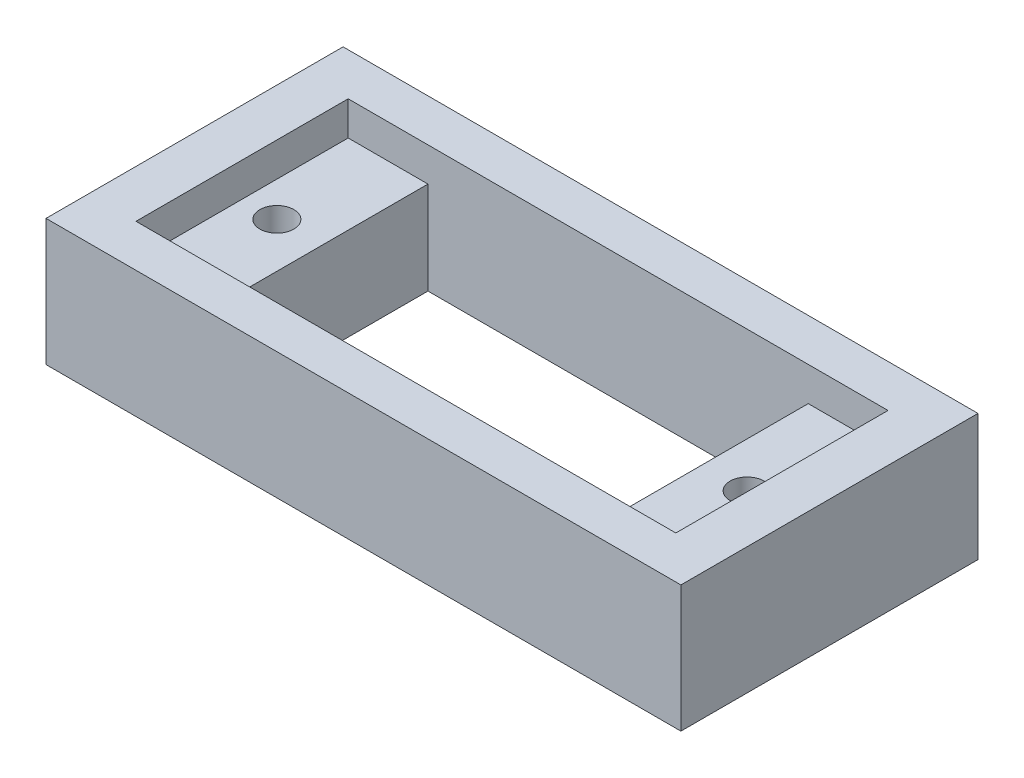
ISO-10303-21;
HEADER;
FILE_DESCRIPTION(('STEP AP214'),'2;1');
FILE_NAME('part.step','',(''),(''),'','','');
FILE_SCHEMA(('AUTOMOTIVE_DESIGN { 1 0 10303 214 1 1 1 1 }'));
ENDSEC;
DATA;
#1=APPLICATION_CONTEXT('core data for automotive mechanical design processes');
#2=APPLICATION_PROTOCOL_DEFINITION('international standard','automotive_design',2000,#1);
#3=PRODUCT_CONTEXT('',#1,'mechanical');
#4=PRODUCT('Part','Part','',(#3));
#5=PRODUCT_RELATED_PRODUCT_CATEGORY('part','',(#4));
#6=PRODUCT_DEFINITION_FORMATION('','',#4);
#7=PRODUCT_DEFINITION_CONTEXT('part definition',#1,'design');
#8=PRODUCT_DEFINITION('design','',#6,#7);
#9=PRODUCT_DEFINITION_SHAPE('','',#8);
#10=(LENGTH_UNIT() NAMED_UNIT(*) SI_UNIT(.MILLI.,.METRE.));
#11=(NAMED_UNIT(*) PLANE_ANGLE_UNIT() SI_UNIT($,.RADIAN.));
#12=(NAMED_UNIT(*) SI_UNIT($,.STERADIAN.) SOLID_ANGLE_UNIT());
#13=UNCERTAINTY_MEASURE_WITH_UNIT(LENGTH_MEASURE(1.E-05),#10,'distance_accuracy_value','');
#14=(GEOMETRIC_REPRESENTATION_CONTEXT(3) GLOBAL_UNCERTAINTY_ASSIGNED_CONTEXT((#13)) GLOBAL_UNIT_ASSIGNED_CONTEXT((#10,
#11,#12)) REPRESENTATION_CONTEXT('',''));
#15=CARTESIAN_POINT('',(0.,0.,0.));
#16=DIRECTION('',(0.,0.,1.));
#17=DIRECTION('',(1.,0.,0.));
#18=AXIS2_PLACEMENT_3D('',#15,#16,#17);
#19=CARTESIAN_POINT('',(11.2,-7.46,-6.25));
#20=DIRECTION('',(1.,0.,0.));
#21=DIRECTION('',(0.,0.,-1.));
#22=AXIS2_PLACEMENT_3D('',#19,#20,#21);
#23=PLANE('',#22);
#24=DIRECTION('',(0.,0.,1.));
#25=VECTOR('',#24,1.);
#26=CARTESIAN_POINT('',(11.2,-2.,-6.25));
#27=LINE('',#26,#25);
#28=CARTESIAN_POINT('',(11.2,-2.,-6.25));
#29=VERTEX_POINT('',#28);
#30=CARTESIAN_POINT('',(11.2,-2.,6.25));
#31=VERTEX_POINT('',#30);
#32=EDGE_CURVE('E165',#29,#31,#27,.T.);
#33=ORIENTED_EDGE('',*,*,#32,.F.);
#34=DIRECTION('',(0.,1.,0.));
#35=VECTOR('',#34,1.);
#36=CARTESIAN_POINT('',(11.2,-7.46,-6.25));
#37=LINE('',#36,#35);
#38=CARTESIAN_POINT('',(11.2,-7.46,-6.25));
#39=VERTEX_POINT('',#38);
#40=EDGE_CURVE('E137',#39,#29,#37,.T.);
#41=ORIENTED_EDGE('',*,*,#40,.F.);
#42=DIRECTION('',(0.,0.,-1.));
#43=VECTOR('',#42,1.);
#44=CARTESIAN_POINT('',(11.2,-7.46,-6.25));
#45=LINE('',#44,#43);
#46=CARTESIAN_POINT('',(11.2,-7.46,6.25));
#47=VERTEX_POINT('',#46);
#48=EDGE_CURVE('E174',#47,#39,#45,.T.);
#49=ORIENTED_EDGE('',*,*,#48,.F.);
#50=DIRECTION('',(0.,1.,0.));
#51=VECTOR('',#50,1.);
#52=CARTESIAN_POINT('',(11.2,-7.46,6.25));
#53=LINE('',#52,#51);
#54=EDGE_CURVE('E189',#47,#31,#53,.T.);
#55=ORIENTED_EDGE('',*,*,#54,.T.);
#56=EDGE_LOOP('',(#33,#41,#49,#55));
#57=FACE_BOUND('',#56,.T.);
#58=ADVANCED_FACE('F32',(#57),#23,.F.);
#59=CARTESIAN_POINT('',(-11.2,-7.46,-6.25));
#60=DIRECTION('',(-1.,0.,0.));
#61=DIRECTION('',(0.,0.,1.));
#62=AXIS2_PLACEMENT_3D('',#59,#60,#61);
#63=PLANE('',#62);
#64=DIRECTION('',(0.,0.,-1.));
#65=VECTOR('',#64,1.);
#66=CARTESIAN_POINT('',(-11.2,-2.,-6.25));
#67=LINE('',#66,#65);
#68=CARTESIAN_POINT('',(-11.2,-2.,6.25));
#69=VERTEX_POINT('',#68);
#70=CARTESIAN_POINT('',(-11.2,-2.,-6.25));
#71=VERTEX_POINT('',#70);
#72=EDGE_CURVE('E163',#69,#71,#67,.T.);
#73=ORIENTED_EDGE('',*,*,#72,.F.);
#74=DIRECTION('',(0.,1.,0.));
#75=VECTOR('',#74,1.);
#76=CARTESIAN_POINT('',(-11.2,-7.46,6.25));
#77=LINE('',#76,#75);
#78=CARTESIAN_POINT('',(-11.2,-7.46,6.25));
#79=VERTEX_POINT('',#78);
#80=EDGE_CURVE('E193',#79,#69,#77,.T.);
#81=ORIENTED_EDGE('',*,*,#80,.F.);
#82=DIRECTION('',(0.,0.,1.));
#83=VECTOR('',#82,1.);
#84=CARTESIAN_POINT('',(-11.2,-7.46,-6.25));
#85=LINE('',#84,#83);
#86=CARTESIAN_POINT('',(-11.2,-7.46,-6.25));
#87=VERTEX_POINT('',#86);
#88=EDGE_CURVE('E181',#87,#79,#85,.T.);
#89=ORIENTED_EDGE('',*,*,#88,.F.);
#90=DIRECTION('',(0.,1.,0.));
#91=VECTOR('',#90,1.);
#92=CARTESIAN_POINT('',(-11.2,-7.46,-6.25));
#93=LINE('',#92,#91);
#94=EDGE_CURVE('E196',#87,#71,#93,.T.);
#95=ORIENTED_EDGE('',*,*,#94,.T.);
#96=EDGE_LOOP('',(#73,#81,#89,#95));
#97=FACE_BOUND('',#96,.T.);
#98=ADVANCED_FACE('F253',(#97),#63,.F.);
#99=CARTESIAN_POINT('',(13.85,-7.46,0.));
#100=DIRECTION('',(0.,1.,0.));
#101=DIRECTION('',(0.,0.,1.));
#102=AXIS2_PLACEMENT_3D('',#99,#100,#101);
#103=CYLINDRICAL_SURFACE('',#102,1.);
#104=CARTESIAN_POINT('',(13.85,-7.46,0.));
#105=DIRECTION('',(0.,1.,0.));
#106=DIRECTION('',(0.,0.,1.));
#107=AXIS2_PLACEMENT_3D('',#104,#105,#106);
#108=CIRCLE('',#107,1.);
#109=CARTESIAN_POINT('',(13.85,-7.46,1.));
#110=VERTEX_POINT('',#109);
#111=EDGE_CURVE('E170',#110,#110,#108,.T.);
#112=CARTESIAN_POINT('',(13.85,-2.,0.));
#113=DIRECTION('',(0.,1.,0.));
#114=DIRECTION('',(0.,0.,1.));
#115=AXIS2_PLACEMENT_3D('',#112,#113,#114);
#116=CIRCLE('',#115,1.);
#117=CARTESIAN_POINT('',(13.85,-2.,1.));
#118=VERTEX_POINT('',#117);
#119=EDGE_CURVE('E160',#118,#118,#116,.F.);
#120=CARTESIAN_POINT('',(13.85,-7.46,1.));
#121=CARTESIAN_POINT('',(13.85,-7.403125,1.));
#122=CARTESIAN_POINT('',(13.85,-7.34625,1.));
#123=CARTESIAN_POINT('',(13.85,-7.2325,1.));
#124=CARTESIAN_POINT('',(13.85,-7.175625,1.));
#125=CARTESIAN_POINT('',(13.85,-7.061875,1.));
#126=CARTESIAN_POINT('',(13.85,-7.005,1.));
#127=CARTESIAN_POINT('',(13.85,-6.89125,1.));
#128=CARTESIAN_POINT('',(13.85,-6.834375,1.));
#129=CARTESIAN_POINT('',(13.85,-6.720625,1.));
#130=CARTESIAN_POINT('',(13.85,-6.66375,1.));
#131=CARTESIAN_POINT('',(13.85,-6.55,1.));
#132=CARTESIAN_POINT('',(13.85,-6.493125,1.));
#133=CARTESIAN_POINT('',(13.85,-6.379375,1.));
#134=CARTESIAN_POINT('',(13.85,-6.3225,1.));
#135=CARTESIAN_POINT('',(13.85,-6.20875,1.));
#136=CARTESIAN_POINT('',(13.85,-6.151875,1.));
#137=CARTESIAN_POINT('',(13.85,-6.038125,1.));
#138=CARTESIAN_POINT('',(13.85,-5.98125,1.));
#139=CARTESIAN_POINT('',(13.85,-5.8675,1.));
#140=CARTESIAN_POINT('',(13.85,-5.810625,1.));
#141=CARTESIAN_POINT('',(13.85,-5.696875,1.));
#142=CARTESIAN_POINT('',(13.85,-5.64,1.));
#143=CARTESIAN_POINT('',(13.85,-5.52625,1.));
#144=CARTESIAN_POINT('',(13.85,-5.469375,1.));
#145=CARTESIAN_POINT('',(13.85,-5.355625,1.));
#146=CARTESIAN_POINT('',(13.85,-5.29875,1.));
#147=CARTESIAN_POINT('',(13.85,-5.185,1.));
#148=CARTESIAN_POINT('',(13.85,-5.128125,1.));
#149=CARTESIAN_POINT('',(13.85,-5.014375,1.));
#150=CARTESIAN_POINT('',(13.85,-4.9575,1.));
#151=CARTESIAN_POINT('',(13.85,-4.84375,1.));
#152=CARTESIAN_POINT('',(13.85,-4.786875,1.));
#153=CARTESIAN_POINT('',(13.85,-4.673125,1.));
#154=CARTESIAN_POINT('',(13.85,-4.61625,1.));
#155=CARTESIAN_POINT('',(13.85,-4.5025,1.));
#156=CARTESIAN_POINT('',(13.85,-4.445625,1.));
#157=CARTESIAN_POINT('',(13.85,-4.331875,1.));
#158=CARTESIAN_POINT('',(13.85,-4.275,1.));
#159=CARTESIAN_POINT('',(13.85,-4.16125,1.));
#160=CARTESIAN_POINT('',(13.85,-4.104375,1.));
#161=CARTESIAN_POINT('',(13.85,-3.990625,1.));
#162=CARTESIAN_POINT('',(13.85,-3.93375,1.));
#163=CARTESIAN_POINT('',(13.85,-3.82,1.));
#164=CARTESIAN_POINT('',(13.85,-3.763125,1.));
#165=CARTESIAN_POINT('',(13.85,-3.649375,1.));
#166=CARTESIAN_POINT('',(13.85,-3.5925,1.));
#167=CARTESIAN_POINT('',(13.85,-3.47875,1.));
#168=CARTESIAN_POINT('',(13.85,-3.421875,1.));
#169=CARTESIAN_POINT('',(13.85,-3.308125,1.));
#170=CARTESIAN_POINT('',(13.85,-3.25125,1.));
#171=CARTESIAN_POINT('',(13.85,-3.1375,1.));
#172=CARTESIAN_POINT('',(13.85,-3.080625,1.));
#173=CARTESIAN_POINT('',(13.85,-2.966875,1.));
#174=CARTESIAN_POINT('',(13.85,-2.91,1.));
#175=CARTESIAN_POINT('',(13.85,-2.79625,1.));
#176=CARTESIAN_POINT('',(13.85,-2.739375,1.));
#177=CARTESIAN_POINT('',(13.85,-2.625625,1.));
#178=CARTESIAN_POINT('',(13.85,-2.56875,1.));
#179=CARTESIAN_POINT('',(13.85,-2.455,1.));
#180=CARTESIAN_POINT('',(13.85,-2.398125,1.));
#181=CARTESIAN_POINT('',(13.85,-2.284375,1.));
#182=CARTESIAN_POINT('',(13.85,-2.2275,1.));
#183=CARTESIAN_POINT('',(13.85,-2.11375,1.));
#184=CARTESIAN_POINT('',(13.85,-2.056875,1.));
#185=CARTESIAN_POINT('',(13.85,-2.,1.));
#186=B_SPLINE_CURVE_WITH_KNOTS('',3,(#120,#121,#122,#123,#124,#125,#126,#127,#128,#129,#130,
#131,#132,#133,#134,#135,#136,#137,#138,#139,#140,#141,#142,#143,#144,#145,#146,#147,#148,#149,
#150,#151,#152,#153,#154,#155,#156,#157,#158,#159,#160,#161,#162,#163,#164,#165,#166,#167,#168,
#169,#170,#171,#172,#173,#174,#175,#176,#177,#178,#179,#180,#181,#182,#183,#184,#185),
.UNSPECIFIED.,.F.,.F.,(4,2,2,2,2,2,2,2,2,2,2,2,2,2,2,2,2,2,2,2,2,2,2,2,2,2,2,2,2,2,2,2,4),(0.,
0.170625000000001,0.34125,0.511875,0.6825,0.853125000000001,1.02375,1.194375,1.365,1.535625,
1.70625,1.876875,2.0475,2.218125,2.38875,2.559375,2.73,2.900625,3.07125,3.241875,3.4125,
3.583125,3.75375,3.924375,4.095,4.265625,4.43625,4.606875,4.7775,4.948125,5.11875,5.289375,
5.46),.UNSPECIFIED.);
#187=EDGE_CURVE('BSEAM259',#110,#118,#186,.T.);
#188=ORIENTED_EDGE('',*,*,#111,.F.);
#189=ORIENTED_EDGE('',*,*,#119,.F.);
#190=ORIENTED_EDGE('',*,*,#187,.T.);
#191=ORIENTED_EDGE('',*,*,#187,.F.);
#192=EDGE_LOOP('',(#188,#190,#189,#191));
#193=FACE_BOUND('',#192,.T.);
#194=ADVANCED_FACE('F259',(#193),#103,.F.);
#195=CARTESIAN_POINT('',(-13.85,-7.46,0.));
#196=DIRECTION('',(0.,1.,0.));
#197=DIRECTION('',(0.,0.,1.));
#198=AXIS2_PLACEMENT_3D('',#195,#196,#197);
#199=CYLINDRICAL_SURFACE('',#198,1.);
#200=CARTESIAN_POINT('',(-13.85,-7.46,0.));
#201=DIRECTION('',(0.,1.,0.));
#202=DIRECTION('',(0.,0.,-1.));
#203=AXIS2_PLACEMENT_3D('',#200,#201,#202);
#204=CIRCLE('',#203,1.);
#205=CARTESIAN_POINT('',(-13.85,-7.46,1.00000000000001));
#206=VERTEX_POINT('',#205);
#207=EDGE_CURVE('E167',#206,#206,#204,.T.);
#208=CARTESIAN_POINT('',(-13.85,-2.,0.));
#209=DIRECTION('',(0.,1.,0.));
#210=DIRECTION('',(0.,0.,1.));
#211=AXIS2_PLACEMENT_3D('',#208,#209,#210);
#212=CIRCLE('',#211,1.);
#213=CARTESIAN_POINT('',(-13.85,-2.,1.00000000000001));
#214=VERTEX_POINT('',#213);
#215=EDGE_CURVE('E36',#214,#214,#212,.F.);
#216=CARTESIAN_POINT('',(-13.85,-7.46,1.00000000000001));
#217=CARTESIAN_POINT('',(-13.85,-7.403125,1.00000000000001));
#218=CARTESIAN_POINT('',(-13.85,-7.34625,1.00000000000001));
#219=CARTESIAN_POINT('',(-13.85,-7.2325,1.00000000000001));
#220=CARTESIAN_POINT('',(-13.85,-7.175625,1.00000000000001));
#221=CARTESIAN_POINT('',(-13.85,-7.061875,1.00000000000001));
#222=CARTESIAN_POINT('',(-13.85,-7.005,1.00000000000001));
#223=CARTESIAN_POINT('',(-13.85,-6.89125,1.00000000000001));
#224=CARTESIAN_POINT('',(-13.85,-6.834375,1.00000000000001));
#225=CARTESIAN_POINT('',(-13.85,-6.720625,1.00000000000001));
#226=CARTESIAN_POINT('',(-13.85,-6.66375,1.00000000000001));
#227=CARTESIAN_POINT('',(-13.85,-6.55,1.00000000000001));
#228=CARTESIAN_POINT('',(-13.85,-6.493125,1.00000000000001));
#229=CARTESIAN_POINT('',(-13.85,-6.379375,1.00000000000001));
#230=CARTESIAN_POINT('',(-13.85,-6.3225,1.00000000000001));
#231=CARTESIAN_POINT('',(-13.85,-6.20875,1.00000000000001));
#232=CARTESIAN_POINT('',(-13.85,-6.151875,1.00000000000001));
#233=CARTESIAN_POINT('',(-13.85,-6.038125,1.00000000000001));
#234=CARTESIAN_POINT('',(-13.85,-5.98125,1.00000000000001));
#235=CARTESIAN_POINT('',(-13.85,-5.8675,1.00000000000001));
#236=CARTESIAN_POINT('',(-13.85,-5.810625,1.00000000000001));
#237=CARTESIAN_POINT('',(-13.85,-5.696875,1.00000000000001));
#238=CARTESIAN_POINT('',(-13.85,-5.64,1.00000000000001));
#239=CARTESIAN_POINT('',(-13.85,-5.52625,1.00000000000001));
#240=CARTESIAN_POINT('',(-13.85,-5.469375,1.00000000000001));
#241=CARTESIAN_POINT('',(-13.85,-5.355625,1.00000000000001));
#242=CARTESIAN_POINT('',(-13.85,-5.29875,1.00000000000001));
#243=CARTESIAN_POINT('',(-13.85,-5.185,1.00000000000001));
#244=CARTESIAN_POINT('',(-13.85,-5.128125,1.00000000000001));
#245=CARTESIAN_POINT('',(-13.85,-5.014375,1.00000000000001));
#246=CARTESIAN_POINT('',(-13.85,-4.9575,1.00000000000001));
#247=CARTESIAN_POINT('',(-13.85,-4.84375,1.00000000000001));
#248=CARTESIAN_POINT('',(-13.85,-4.786875,1.00000000000001));
#249=CARTESIAN_POINT('',(-13.85,-4.673125,1.00000000000001));
#250=CARTESIAN_POINT('',(-13.85,-4.61625,1.00000000000001));
#251=CARTESIAN_POINT('',(-13.85,-4.5025,1.00000000000001));
#252=CARTESIAN_POINT('',(-13.85,-4.445625,1.00000000000001));
#253=CARTESIAN_POINT('',(-13.85,-4.331875,1.00000000000001));
#254=CARTESIAN_POINT('',(-13.85,-4.275,1.00000000000001));
#255=CARTESIAN_POINT('',(-13.85,-4.16125,1.00000000000001));
#256=CARTESIAN_POINT('',(-13.85,-4.104375,1.00000000000001));
#257=CARTESIAN_POINT('',(-13.85,-3.990625,1.00000000000001));
#258=CARTESIAN_POINT('',(-13.85,-3.93375,1.00000000000001));
#259=CARTESIAN_POINT('',(-13.85,-3.82,1.00000000000001));
#260=CARTESIAN_POINT('',(-13.85,-3.763125,1.00000000000001));
#261=CARTESIAN_POINT('',(-13.85,-3.649375,1.00000000000001));
#262=CARTESIAN_POINT('',(-13.85,-3.5925,1.00000000000001));
#263=CARTESIAN_POINT('',(-13.85,-3.47875,1.00000000000001));
#264=CARTESIAN_POINT('',(-13.85,-3.421875,1.00000000000001));
#265=CARTESIAN_POINT('',(-13.85,-3.308125,1.00000000000001));
#266=CARTESIAN_POINT('',(-13.85,-3.25125,1.00000000000001));
#267=CARTESIAN_POINT('',(-13.85,-3.1375,1.00000000000001));
#268=CARTESIAN_POINT('',(-13.85,-3.080625,1.00000000000001));
#269=CARTESIAN_POINT('',(-13.85,-2.966875,1.00000000000001));
#270=CARTESIAN_POINT('',(-13.85,-2.91,1.00000000000001));
#271=CARTESIAN_POINT('',(-13.85,-2.79625,1.00000000000001));
#272=CARTESIAN_POINT('',(-13.85,-2.739375,1.00000000000001));
#273=CARTESIAN_POINT('',(-13.85,-2.625625,1.00000000000001));
#274=CARTESIAN_POINT('',(-13.85,-2.56875,1.00000000000001));
#275=CARTESIAN_POINT('',(-13.85,-2.455,1.00000000000001));
#276=CARTESIAN_POINT('',(-13.85,-2.398125,1.00000000000001));
#277=CARTESIAN_POINT('',(-13.85,-2.284375,1.00000000000001));
#278=CARTESIAN_POINT('',(-13.85,-2.2275,1.00000000000001));
#279=CARTESIAN_POINT('',(-13.85,-2.11375,1.00000000000001));
#280=CARTESIAN_POINT('',(-13.85,-2.056875,1.00000000000001));
#281=CARTESIAN_POINT('',(-13.85,-2.,1.00000000000001));
#282=B_SPLINE_CURVE_WITH_KNOTS('',3,(#216,#217,#218,#219,#220,#221,#222,#223,#224,#225,#226,
#227,#228,#229,#230,#231,#232,#233,#234,#235,#236,#237,#238,#239,#240,#241,#242,#243,#244,#245,
#246,#247,#248,#249,#250,#251,#252,#253,#254,#255,#256,#257,#258,#259,#260,#261,#262,#263,#264,
#265,#266,#267,#268,#269,#270,#271,#272,#273,#274,#275,#276,#277,#278,#279,#280,#281),
.UNSPECIFIED.,.F.,.F.,(4,2,2,2,2,2,2,2,2,2,2,2,2,2,2,2,2,2,2,2,2,2,2,2,2,2,2,2,2,2,2,2,4),(0.,
0.170625000000001,0.34125,0.511875,0.6825,0.853125000000001,1.02375,1.194375,1.365,1.535625,
1.70625,1.876875,2.0475,2.218125,2.38875,2.559375,2.73,2.900625,3.07125,3.241875,3.4125,
3.583125,3.75375,3.924375,4.095,4.265625,4.43625,4.606875,4.7775,4.948125,5.11875,5.289375,
5.46),.UNSPECIFIED.);
#283=EDGE_CURVE('BSEAM304',#206,#214,#282,.T.);
#284=ORIENTED_EDGE('',*,*,#207,.F.);
#285=ORIENTED_EDGE('',*,*,#215,.F.);
#286=ORIENTED_EDGE('',*,*,#283,.T.);
#287=ORIENTED_EDGE('',*,*,#283,.F.);
#288=EDGE_LOOP('',(#284,#286,#285,#287));
#289=FACE_BOUND('',#288,.T.);
#290=ADVANCED_FACE('F304',(#289),#199,.F.);
#291=CARTESIAN_POINT('',(18.7,-7.46,-8.75));
#292=DIRECTION('',(0.,0.,-1.));
#293=DIRECTION('',(-1.,0.,0.));
#294=AXIS2_PLACEMENT_3D('',#291,#292,#293);
#295=PLANE('',#294);
#296=DIRECTION('',(-1.,0.,0.));
#297=VECTOR('',#296,1.);
#298=CARTESIAN_POINT('',(18.7,0.,-8.75));
#299=LINE('',#298,#297);
#300=CARTESIAN_POINT('',(18.7,0.,-8.75));
#301=VERTEX_POINT('',#300);
#302=CARTESIAN_POINT('',(-18.7,0.,-8.74999999999999));
#303=VERTEX_POINT('',#302);
#304=EDGE_CURVE('E192',#301,#303,#299,.T.);
#305=ORIENTED_EDGE('',*,*,#304,.F.);
#306=DIRECTION('',(0.,1.,0.));
#307=VECTOR('',#306,1.);
#308=CARTESIAN_POINT('',(18.7,-7.46,-8.75));
#309=LINE('',#308,#307);
#310=CARTESIAN_POINT('',(18.7,-7.46,-8.75));
#311=VERTEX_POINT('',#310);
#312=EDGE_CURVE('E11',#311,#301,#309,.T.);
#313=ORIENTED_EDGE('',*,*,#312,.F.);
#314=DIRECTION('',(-1.,0.,0.));
#315=VECTOR('',#314,1.);
#316=CARTESIAN_POINT('',(18.7,-7.46,-8.75));
#317=LINE('',#316,#315);
#318=CARTESIAN_POINT('',(-18.7,-7.46,-8.74999999999999));
#319=VERTEX_POINT('',#318);
#320=EDGE_CURVE('E200',#311,#319,#317,.T.);
#321=ORIENTED_EDGE('',*,*,#320,.T.);
#322=DIRECTION('',(0.,1.,0.));
#323=VECTOR('',#322,1.);
#324=CARTESIAN_POINT('',(-18.7,-7.46,-8.74999999999999));
#325=LINE('',#324,#323);
#326=EDGE_CURVE('E213',#319,#303,#325,.T.);
#327=ORIENTED_EDGE('',*,*,#326,.T.);
#328=EDGE_LOOP('',(#305,#313,#321,#327));
#329=FACE_BOUND('',#328,.T.);
#330=ADVANCED_FACE('F34',(#329),#295,.T.);
#331=CARTESIAN_POINT('',(18.7,-7.46,8.75));
#332=DIRECTION('',(1.,0.,0.));
#333=DIRECTION('',(0.,0.,-1.));
#334=AXIS2_PLACEMENT_3D('',#331,#332,#333);
#335=PLANE('',#334);
#336=DIRECTION('',(0.,0.,-1.));
#337=VECTOR('',#336,1.);
#338=CARTESIAN_POINT('',(18.7,0.,8.75));
#339=LINE('',#338,#337);
#340=CARTESIAN_POINT('',(18.7,0.,8.75));
#341=VERTEX_POINT('',#340);
#342=EDGE_CURVE('E204',#341,#301,#339,.T.);
#343=ORIENTED_EDGE('',*,*,#342,.F.);
#344=DIRECTION('',(0.,1.,0.));
#345=VECTOR('',#344,1.);
#346=CARTESIAN_POINT('',(18.7,-7.46,8.75));
#347=LINE('',#346,#345);
#348=CARTESIAN_POINT('',(18.7,-7.46,8.75));
#349=VERTEX_POINT('',#348);
#350=EDGE_CURVE('E41',#349,#341,#347,.T.);
#351=ORIENTED_EDGE('',*,*,#350,.F.);
#352=DIRECTION('',(0.,0.,-1.));
#353=VECTOR('',#352,1.);
#354=CARTESIAN_POINT('',(18.7,-7.46,8.75));
#355=LINE('',#354,#353);
#356=EDGE_CURVE('E210',#349,#311,#355,.T.);
#357=ORIENTED_EDGE('',*,*,#356,.T.);
#358=ORIENTED_EDGE('',*,*,#312,.T.);
#359=EDGE_LOOP('',(#343,#351,#357,#358));
#360=FACE_BOUND('',#359,.T.);
#361=ADVANCED_FACE('F238',(#360),#335,.T.);
#362=CARTESIAN_POINT('',(-18.7,-7.46,8.75));
#363=DIRECTION('',(0.,0.,1.));
#364=DIRECTION('',(1.,0.,0.));
#365=AXIS2_PLACEMENT_3D('',#362,#363,#364);
#366=PLANE('',#365);
#367=DIRECTION('',(1.,0.,0.));
#368=VECTOR('',#367,1.);
#369=CARTESIAN_POINT('',(-18.7,0.,8.75));
#370=LINE('',#369,#368);
#371=CARTESIAN_POINT('',(-18.7,0.,8.75));
#372=VERTEX_POINT('',#371);
#373=EDGE_CURVE('E219',#372,#341,#370,.T.);
#374=ORIENTED_EDGE('',*,*,#373,.F.);
#375=DIRECTION('',(0.,1.,0.));
#376=VECTOR('',#375,1.);
#377=CARTESIAN_POINT('',(-18.7,-7.46,8.75));
#378=LINE('',#377,#376);
#379=CARTESIAN_POINT('',(-18.7,-7.46,8.75));
#380=VERTEX_POINT('',#379);
#381=EDGE_CURVE('E225',#380,#372,#378,.T.);
#382=ORIENTED_EDGE('',*,*,#381,.F.);
#383=DIRECTION('',(1.,0.,0.));
#384=VECTOR('',#383,1.);
#385=CARTESIAN_POINT('',(-18.7,-7.46,8.75));
#386=LINE('',#385,#384);
#387=EDGE_CURVE('E207',#380,#349,#386,.T.);
#388=ORIENTED_EDGE('',*,*,#387,.T.);
#389=ORIENTED_EDGE('',*,*,#350,.T.);
#390=EDGE_LOOP('',(#374,#382,#388,#389));
#391=FACE_BOUND('',#390,.T.);
#392=ADVANCED_FACE('F244',(#391),#366,.T.);
#393=CARTESIAN_POINT('',(-18.7,-7.46,-8.74999999999999));
#394=DIRECTION('',(-1.,0.,0.));
#395=DIRECTION('',(0.,0.,1.));
#396=AXIS2_PLACEMENT_3D('',#393,#394,#395);
#397=PLANE('',#396);
#398=DIRECTION('',(0.,0.,1.));
#399=VECTOR('',#398,1.);
#400=CARTESIAN_POINT('',(-18.7,0.,-8.74999999999999));
#401=LINE('',#400,#399);
#402=EDGE_CURVE('E216',#303,#372,#401,.T.);
#403=ORIENTED_EDGE('',*,*,#402,.F.);
#404=ORIENTED_EDGE('',*,*,#326,.F.);
#405=DIRECTION('',(0.,0.,1.));
#406=VECTOR('',#405,1.);
#407=CARTESIAN_POINT('',(-18.7,-7.46,-8.74999999999999));
#408=LINE('',#407,#406);
#409=EDGE_CURVE('E203',#319,#380,#408,.T.);
#410=ORIENTED_EDGE('',*,*,#409,.T.);
#411=ORIENTED_EDGE('',*,*,#381,.T.);
#412=EDGE_LOOP('',(#403,#404,#410,#411));
#413=FACE_BOUND('',#412,.T.);
#414=ADVANCED_FACE('F232',(#413),#397,.T.);
#415=CARTESIAN_POINT('',(0.,-7.46,0.));
#416=DIRECTION('',(0.,1.,0.));
#417=DIRECTION('',(0.,0.,1.));
#418=AXIS2_PLACEMENT_3D('',#415,#416,#417);
#419=PLANE('',#418);
#420=ORIENTED_EDGE('',*,*,#207,.T.);
#421=EDGE_LOOP('',(#420));
#422=FACE_BOUND('',#421,.T.);
#423=ORIENTED_EDGE('',*,*,#111,.T.);
#424=EDGE_LOOP('',(#423));
#425=FACE_BOUND('',#424,.T.);
#426=DIRECTION('',(1.,0.,0.));
#427=VECTOR('',#426,1.);
#428=CARTESIAN_POINT('',(-11.2,-7.46,6.25));
#429=LINE('',#428,#427);
#430=EDGE_CURVE('E184',#79,#47,#429,.T.);
#431=ORIENTED_EDGE('',*,*,#430,.T.);
#432=ORIENTED_EDGE('',*,*,#48,.T.);
#433=DIRECTION('',(-1.,0.,0.));
#434=VECTOR('',#433,1.);
#435=CARTESIAN_POINT('',(-11.2,-7.46,-6.25));
#436=LINE('',#435,#434);
#437=EDGE_CURVE('E177',#39,#87,#436,.T.);
#438=ORIENTED_EDGE('',*,*,#437,.T.);
#439=ORIENTED_EDGE('',*,*,#88,.T.);
#440=EDGE_LOOP('',(#431,#432,#438,#439));
#441=FACE_BOUND('',#440,.T.);
#442=ORIENTED_EDGE('',*,*,#320,.F.);
#443=ORIENTED_EDGE('',*,*,#356,.F.);
#444=ORIENTED_EDGE('',*,*,#387,.F.);
#445=ORIENTED_EDGE('',*,*,#409,.F.);
#446=EDGE_LOOP('',(#442,#443,#444,#445));
#447=FACE_BOUND('',#446,.T.);
#448=ADVANCED_FACE('F241',(#422,#425,#441,#447),#419,.F.);
#449=CARTESIAN_POINT('',(0.,0.,0.));
#450=DIRECTION('',(0.,1.,0.));
#451=DIRECTION('',(0.,0.,1.));
#452=AXIS2_PLACEMENT_3D('',#449,#450,#451);
#453=PLANE('',#452);
#454=DIRECTION('',(0.,0.,-1.));
#455=VECTOR('',#454,1.);
#456=CARTESIAN_POINT('',(15.9,0.,-6.25));
#457=LINE('',#456,#455);
#458=CARTESIAN_POINT('',(15.9,0.,6.25));
#459=VERTEX_POINT('',#458);
#460=CARTESIAN_POINT('',(15.9,0.,-6.25));
#461=VERTEX_POINT('',#460);
#462=EDGE_CURVE('E130',#459,#461,#457,.T.);
#463=ORIENTED_EDGE('',*,*,#462,.F.);
#464=DIRECTION('',(1.,0.,0.));
#465=VECTOR('',#464,1.);
#466=CARTESIAN_POINT('',(-11.2,0.,6.25));
#467=LINE('',#466,#465);
#468=CARTESIAN_POINT('',(-15.9,0.,6.25));
#469=VERTEX_POINT('',#468);
#470=EDGE_CURVE('E178',#469,#459,#467,.T.);
#471=ORIENTED_EDGE('',*,*,#470,.F.);
#472=DIRECTION('',(0.,0.,1.));
#473=VECTOR('',#472,1.);
#474=CARTESIAN_POINT('',(-15.9,0.,-6.25));
#475=LINE('',#474,#473);
#476=CARTESIAN_POINT('',(-15.9,0.,-6.25));
#477=VERTEX_POINT('',#476);
#478=EDGE_CURVE('E145',#477,#469,#475,.T.);
#479=ORIENTED_EDGE('',*,*,#478,.F.);
#480=DIRECTION('',(-1.,0.,0.));
#481=VECTOR('',#480,1.);
#482=CARTESIAN_POINT('',(-11.2,0.,-6.25));
#483=LINE('',#482,#481);
#484=EDGE_CURVE('E173',#461,#477,#483,.T.);
#485=ORIENTED_EDGE('',*,*,#484,.F.);
#486=EDGE_LOOP('',(#463,#471,#479,#485));
#487=FACE_BOUND('',#486,.T.);
#488=ORIENTED_EDGE('',*,*,#304,.T.);
#489=ORIENTED_EDGE('',*,*,#402,.T.);
#490=ORIENTED_EDGE('',*,*,#373,.T.);
#491=ORIENTED_EDGE('',*,*,#342,.T.);
#492=EDGE_LOOP('',(#488,#489,#490,#491));
#493=FACE_BOUND('',#492,.T.);
#494=ADVANCED_FACE('F235',(#487,#493),#453,.T.);
#495=CARTESIAN_POINT('',(-11.2,-7.46,6.25));
#496=DIRECTION('',(0.,0.,1.));
#497=DIRECTION('',(1.,0.,0.));
#498=AXIS2_PLACEMENT_3D('',#495,#496,#497);
#499=PLANE('',#498);
#500=ORIENTED_EDGE('',*,*,#470,.T.);
#501=DIRECTION('',(0.,1.,0.));
#502=VECTOR('',#501,1.);
#503=CARTESIAN_POINT('',(15.9,-2.,6.25));
#504=LINE('',#503,#502);
#505=CARTESIAN_POINT('',(15.9,-2.,6.25));
#506=VERTEX_POINT('',#505);
#507=EDGE_CURVE('E153',#506,#459,#504,.T.);
#508=ORIENTED_EDGE('',*,*,#507,.F.);
#509=DIRECTION('',(1.,0.,0.));
#510=VECTOR('',#509,1.);
#511=CARTESIAN_POINT('',(-15.9,-2.,6.25));
#512=LINE('',#511,#510);
#513=EDGE_CURVE('E143',#31,#506,#512,.T.);
#514=ORIENTED_EDGE('',*,*,#513,.F.);
#515=ORIENTED_EDGE('',*,*,#54,.F.);
#516=ORIENTED_EDGE('',*,*,#430,.F.);
#517=ORIENTED_EDGE('',*,*,#80,.T.);
#518=CARTESIAN_POINT('',(-15.9,-2.,6.25));
#519=VERTEX_POINT('',#518);
#520=EDGE_CURVE('E49',#519,#69,#512,.T.);
#521=ORIENTED_EDGE('',*,*,#520,.F.);
#522=DIRECTION('',(0.,1.,0.));
#523=VECTOR('',#522,1.);
#524=CARTESIAN_POINT('',(-15.9,-2.,6.25));
#525=LINE('',#524,#523);
#526=EDGE_CURVE('E155',#519,#469,#525,.T.);
#527=ORIENTED_EDGE('',*,*,#526,.T.);
#528=EDGE_LOOP('',(#500,#508,#514,#515,#516,#517,#521,#527));
#529=FACE_BOUND('',#528,.T.);
#530=ADVANCED_FACE('F268',(#529),#499,.F.);
#531=CARTESIAN_POINT('',(-11.2,-7.46,-6.25));
#532=DIRECTION('',(0.,0.,-1.));
#533=DIRECTION('',(-1.,0.,0.));
#534=AXIS2_PLACEMENT_3D('',#531,#532,#533);
#535=PLANE('',#534);
#536=ORIENTED_EDGE('',*,*,#484,.T.);
#537=DIRECTION('',(0.,1.,0.));
#538=VECTOR('',#537,1.);
#539=CARTESIAN_POINT('',(-15.9,-2.,-6.25));
#540=LINE('',#539,#538);
#541=CARTESIAN_POINT('',(-15.9,-2.,-6.25));
#542=VERTEX_POINT('',#541);
#543=EDGE_CURVE('E132',#542,#477,#540,.T.);
#544=ORIENTED_EDGE('',*,*,#543,.F.);
#545=DIRECTION('',(-1.,0.,0.));
#546=VECTOR('',#545,1.);
#547=CARTESIAN_POINT('',(-15.9,-2.,-6.25));
#548=LINE('',#547,#546);
#549=EDGE_CURVE('E139',#71,#542,#548,.T.);
#550=ORIENTED_EDGE('',*,*,#549,.F.);
#551=ORIENTED_EDGE('',*,*,#94,.F.);
#552=ORIENTED_EDGE('',*,*,#437,.F.);
#553=ORIENTED_EDGE('',*,*,#40,.T.);
#554=CARTESIAN_POINT('',(15.9,-2.,-6.25));
#555=VERTEX_POINT('',#554);
#556=EDGE_CURVE('E57',#555,#29,#548,.T.);
#557=ORIENTED_EDGE('',*,*,#556,.F.);
#558=DIRECTION('',(0.,1.,0.));
#559=VECTOR('',#558,1.);
#560=CARTESIAN_POINT('',(15.9,-2.,-6.25));
#561=LINE('',#560,#559);
#562=EDGE_CURVE('E125',#555,#461,#561,.T.);
#563=ORIENTED_EDGE('',*,*,#562,.T.);
#564=EDGE_LOOP('',(#536,#544,#550,#551,#552,#553,#557,#563));
#565=FACE_BOUND('',#564,.T.);
#566=ADVANCED_FACE('F135',(#565),#535,.F.);
#567=CARTESIAN_POINT('',(0.,-2.,0.));
#568=DIRECTION('',(0.,1.,0.));
#569=DIRECTION('',(0.,0.,1.));
#570=AXIS2_PLACEMENT_3D('',#567,#568,#569);
#571=PLANE('',#570);
#572=ORIENTED_EDGE('',*,*,#215,.T.);
#573=EDGE_LOOP('',(#572));
#574=FACE_BOUND('',#573,.T.);
#575=ORIENTED_EDGE('',*,*,#72,.T.);
#576=ORIENTED_EDGE('',*,*,#549,.T.);
#577=DIRECTION('',(0.,0.,1.));
#578=VECTOR('',#577,1.);
#579=CARTESIAN_POINT('',(-15.9,-2.,-6.25));
#580=LINE('',#579,#578);
#581=EDGE_CURVE('E138',#542,#519,#580,.T.);
#582=ORIENTED_EDGE('',*,*,#581,.T.);
#583=ORIENTED_EDGE('',*,*,#520,.T.);
#584=EDGE_LOOP('',(#575,#576,#582,#583));
#585=FACE_BOUND('',#584,.T.);
#586=ADVANCED_FACE('F281',(#574,#585),#571,.T.);
#587=CARTESIAN_POINT('',(-15.9,-2.,-6.25));
#588=DIRECTION('',(-1.,0.,0.));
#589=DIRECTION('',(0.,0.,1.));
#590=AXIS2_PLACEMENT_3D('',#587,#588,#589);
#591=PLANE('',#590);
#592=ORIENTED_EDGE('',*,*,#478,.T.);
#593=ORIENTED_EDGE('',*,*,#526,.F.);
#594=ORIENTED_EDGE('',*,*,#581,.F.);
#595=ORIENTED_EDGE('',*,*,#543,.T.);
#596=EDGE_LOOP('',(#592,#593,#594,#595));
#597=FACE_BOUND('',#596,.T.);
#598=ADVANCED_FACE('F280',(#597),#591,.F.);
#599=ORIENTED_EDGE('',*,*,#119,.T.);
#600=EDGE_LOOP('',(#599));
#601=FACE_BOUND('',#600,.T.);
#602=ORIENTED_EDGE('',*,*,#32,.T.);
#603=ORIENTED_EDGE('',*,*,#513,.T.);
#604=DIRECTION('',(0.,0.,-1.));
#605=VECTOR('',#604,1.);
#606=CARTESIAN_POINT('',(15.9,-2.,-6.25));
#607=LINE('',#606,#605);
#608=EDGE_CURVE('E128',#506,#555,#607,.T.);
#609=ORIENTED_EDGE('',*,*,#608,.T.);
#610=ORIENTED_EDGE('',*,*,#556,.T.);
#611=EDGE_LOOP('',(#602,#603,#609,#610));
#612=FACE_BOUND('',#611,.T.);
#613=ADVANCED_FACE('F141',(#601,#612),#571,.T.);
#614=CARTESIAN_POINT('',(15.9,-2.,-6.25));
#615=DIRECTION('',(1.,0.,0.));
#616=DIRECTION('',(0.,0.,-1.));
#617=AXIS2_PLACEMENT_3D('',#614,#615,#616);
#618=PLANE('',#617);
#619=ORIENTED_EDGE('',*,*,#462,.T.);
#620=ORIENTED_EDGE('',*,*,#562,.F.);
#621=ORIENTED_EDGE('',*,*,#608,.F.);
#622=ORIENTED_EDGE('',*,*,#507,.T.);
#623=EDGE_LOOP('',(#619,#620,#621,#622));
#624=FACE_BOUND('',#623,.T.);
#625=ADVANCED_FACE('F126',(#624),#618,.F.);
#626=CLOSED_SHELL('',(#58,#98,#194,#290,#330,#361,#392,#414,#448,#494,#530,#566,#586,#598,#613,#625));
#627=MANIFOLD_SOLID_BREP('B2',#626);
#628=ADVANCED_BREP_SHAPE_REPRESENTATION('',(#18,#627),#14);
#629=SHAPE_DEFINITION_REPRESENTATION(#9,#628);
ENDSEC;
END-ISO-10303-21;
